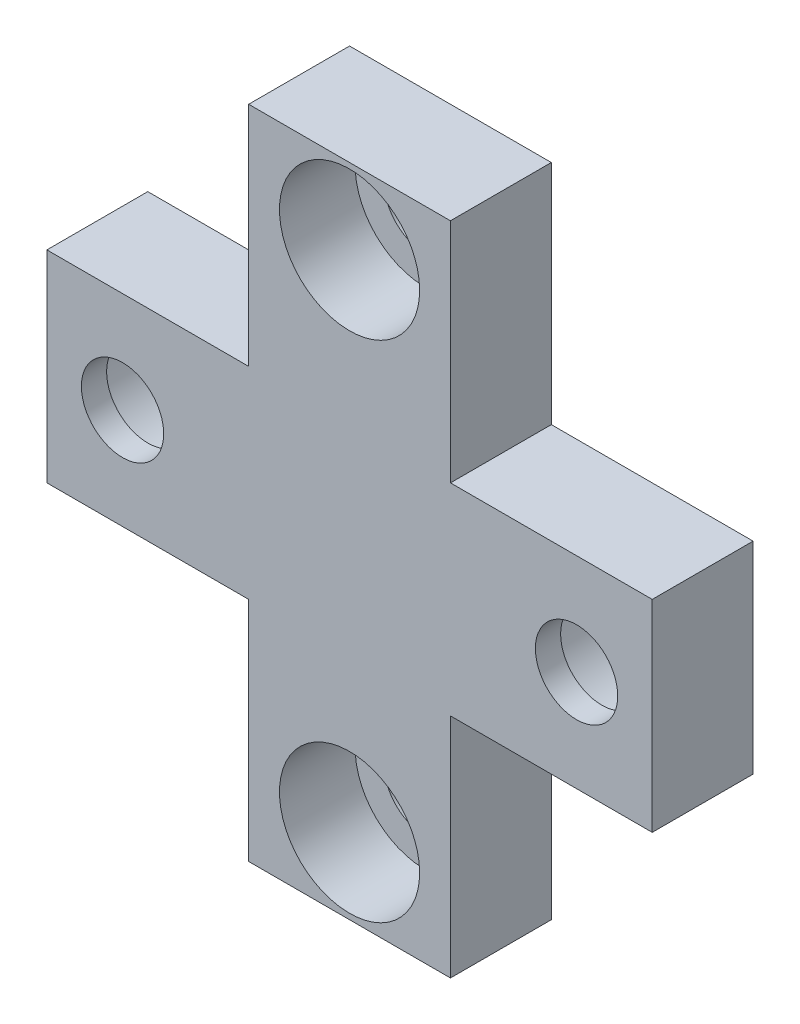
ISO-10303-21;
HEADER;
FILE_DESCRIPTION(('STEP AP214'),'2;1');
FILE_NAME('part.step','',(''),(''),'','','');
FILE_SCHEMA(('AUTOMOTIVE_DESIGN { 1 0 10303 214 1 1 1 1 }'));
ENDSEC;
DATA;
#1=APPLICATION_CONTEXT('core data for automotive mechanical design processes');
#2=APPLICATION_PROTOCOL_DEFINITION('international standard','automotive_design',2000,#1);
#3=PRODUCT_CONTEXT('',#1,'mechanical');
#4=PRODUCT('Part','Part','',(#3));
#5=PRODUCT_RELATED_PRODUCT_CATEGORY('part','',(#4));
#6=PRODUCT_DEFINITION_FORMATION('','',#4);
#7=PRODUCT_DEFINITION_CONTEXT('part definition',#1,'design');
#8=PRODUCT_DEFINITION('design','',#6,#7);
#9=PRODUCT_DEFINITION_SHAPE('','',#8);
#10=(LENGTH_UNIT() NAMED_UNIT(*) SI_UNIT(.MILLI.,.METRE.));
#11=(NAMED_UNIT(*) PLANE_ANGLE_UNIT() SI_UNIT($,.RADIAN.));
#12=(NAMED_UNIT(*) SI_UNIT($,.STERADIAN.) SOLID_ANGLE_UNIT());
#13=UNCERTAINTY_MEASURE_WITH_UNIT(LENGTH_MEASURE(1.E-05),#10,'distance_accuracy_value','');
#14=(GEOMETRIC_REPRESENTATION_CONTEXT(3) GLOBAL_UNCERTAINTY_ASSIGNED_CONTEXT((#13)) GLOBAL_UNIT_ASSIGNED_CONTEXT((#10,
#11,#12)) REPRESENTATION_CONTEXT('',''));
#15=CARTESIAN_POINT('',(0.,0.,0.));
#16=DIRECTION('',(0.,0.,1.));
#17=DIRECTION('',(1.,0.,0.));
#18=AXIS2_PLACEMENT_3D('',#15,#16,#17);
#19=CARTESIAN_POINT('',(0.,0.,4.));
#20=DIRECTION('',(1.,0.,0.));
#21=DIRECTION('',(0.,1.,0.));
#22=AXIS2_PLACEMENT_3D('',#19,#20,#21);
#23=PLANE('',#22);
#24=DIRECTION('',(0.,-1.,0.));
#25=VECTOR('',#24,1.);
#26=CARTESIAN_POINT('',(0.,0.,0.));
#27=LINE('',#26,#25);
#28=CARTESIAN_POINT('',(0.,0.,0.));
#29=VERTEX_POINT('',#28);
#30=CARTESIAN_POINT('',(0.,-9.,0.));
#31=VERTEX_POINT('',#30);
#32=EDGE_CURVE('E171',#29,#31,#27,.T.);
#33=ORIENTED_EDGE('',*,*,#32,.T.);
#34=DIRECTION('',(0.,0.,-1.));
#35=VECTOR('',#34,1.);
#36=CARTESIAN_POINT('',(0.,-9.,4.));
#37=LINE('',#36,#35);
#38=CARTESIAN_POINT('',(0.,-9.,4.));
#39=VERTEX_POINT('',#38);
#40=EDGE_CURVE('E11',#39,#31,#37,.T.);
#41=ORIENTED_EDGE('',*,*,#40,.F.);
#42=DIRECTION('',(0.,-1.,0.));
#43=VECTOR('',#42,1.);
#44=CARTESIAN_POINT('',(0.,0.,4.));
#45=LINE('',#44,#43);
#46=CARTESIAN_POINT('',(0.,0.,4.));
#47=VERTEX_POINT('',#46);
#48=EDGE_CURVE('E114',#47,#39,#45,.T.);
#49=ORIENTED_EDGE('',*,*,#48,.F.);
#50=DIRECTION('',(0.,0.,-1.));
#51=VECTOR('',#50,1.);
#52=CARTESIAN_POINT('',(0.,0.,4.));
#53=LINE('',#52,#51);
#54=EDGE_CURVE('E65',#47,#29,#53,.T.);
#55=ORIENTED_EDGE('',*,*,#54,.T.);
#56=EDGE_LOOP('',(#33,#41,#49,#55));
#57=FACE_BOUND('',#56,.T.);
#58=ADVANCED_FACE('F48',(#57),#23,.F.);
#59=CARTESIAN_POINT('',(0.,-9.,4.));
#60=DIRECTION('',(0.,1.,0.));
#61=DIRECTION('',(0.,0.,1.));
#62=AXIS2_PLACEMENT_3D('',#59,#60,#61);
#63=PLANE('',#62);
#64=DIRECTION('',(1.,0.,0.));
#65=VECTOR('',#64,1.);
#66=CARTESIAN_POINT('',(0.,-9.,0.));
#67=LINE('',#66,#65);
#68=CARTESIAN_POINT('',(-8.,-9.,0.));
#69=VERTEX_POINT('',#68);
#70=EDGE_CURVE('E174',#69,#31,#67,.T.);
#71=ORIENTED_EDGE('',*,*,#70,.F.);
#72=DIRECTION('',(0.,0.,-1.));
#73=VECTOR('',#72,1.);
#74=CARTESIAN_POINT('',(-8.,-9.,4.));
#75=LINE('',#74,#73);
#76=CARTESIAN_POINT('',(-8.,-9.,4.));
#77=VERTEX_POINT('',#76);
#78=EDGE_CURVE('E57',#77,#69,#75,.T.);
#79=ORIENTED_EDGE('',*,*,#78,.F.);
#80=DIRECTION('',(1.,0.,0.));
#81=VECTOR('',#80,1.);
#82=CARTESIAN_POINT('',(0.,-9.,4.));
#83=LINE('',#82,#81);
#84=EDGE_CURVE('E254',#77,#39,#83,.T.);
#85=ORIENTED_EDGE('',*,*,#84,.T.);
#86=ORIENTED_EDGE('',*,*,#40,.T.);
#87=EDGE_LOOP('',(#71,#79,#85,#86));
#88=FACE_BOUND('',#87,.T.);
#89=ADVANCED_FACE('F253',(#88),#63,.T.);
#90=CARTESIAN_POINT('',(-8.,0.,4.));
#91=DIRECTION('',(1.,0.,0.));
#92=DIRECTION('',(0.,0.,-1.));
#93=AXIS2_PLACEMENT_3D('',#90,#91,#92);
#94=PLANE('',#93);
#95=DIRECTION('',(0.,-1.,0.));
#96=VECTOR('',#95,1.);
#97=CARTESIAN_POINT('',(-8.,0.,0.));
#98=LINE('',#97,#96);
#99=CARTESIAN_POINT('',(-8.,-17.,0.));
#100=VERTEX_POINT('',#99);
#101=EDGE_CURVE('E179',#69,#100,#98,.T.);
#102=ORIENTED_EDGE('',*,*,#101,.T.);
#103=DIRECTION('',(0.,0.,-1.));
#104=VECTOR('',#103,1.);
#105=CARTESIAN_POINT('',(-8.,-17.,4.));
#106=LINE('',#105,#104);
#107=CARTESIAN_POINT('',(-8.,-17.,4.));
#108=VERTEX_POINT('',#107);
#109=EDGE_CURVE('E236',#108,#100,#106,.T.);
#110=ORIENTED_EDGE('',*,*,#109,.F.);
#111=DIRECTION('',(0.,-1.,0.));
#112=VECTOR('',#111,1.);
#113=CARTESIAN_POINT('',(-8.,0.,4.));
#114=LINE('',#113,#112);
#115=EDGE_CURVE('E245',#77,#108,#114,.T.);
#116=ORIENTED_EDGE('',*,*,#115,.F.);
#117=ORIENTED_EDGE('',*,*,#78,.T.);
#118=EDGE_LOOP('',(#102,#110,#116,#117));
#119=FACE_BOUND('',#118,.T.);
#120=ADVANCED_FACE('F243',(#119),#94,.F.);
#121=CARTESIAN_POINT('',(0.,-17.,4.));
#122=DIRECTION('',(0.,1.,0.));
#123=DIRECTION('',(0.,0.,1.));
#124=AXIS2_PLACEMENT_3D('',#121,#122,#123);
#125=PLANE('',#124);
#126=DIRECTION('',(1.,0.,0.));
#127=VECTOR('',#126,1.);
#128=CARTESIAN_POINT('',(0.,-17.,0.));
#129=LINE('',#128,#127);
#130=CARTESIAN_POINT('',(0.,-17.,0.));
#131=VERTEX_POINT('',#130);
#132=EDGE_CURVE('E182',#100,#131,#129,.T.);
#133=ORIENTED_EDGE('',*,*,#132,.T.);
#134=DIRECTION('',(0.,0.,-1.));
#135=VECTOR('',#134,1.);
#136=CARTESIAN_POINT('',(0.,-17.,4.));
#137=LINE('',#136,#135);
#138=CARTESIAN_POINT('',(0.,-17.,4.));
#139=VERTEX_POINT('',#138);
#140=EDGE_CURVE('E232',#139,#131,#137,.T.);
#141=ORIENTED_EDGE('',*,*,#140,.F.);
#142=DIRECTION('',(1.,0.,0.));
#143=VECTOR('',#142,1.);
#144=CARTESIAN_POINT('',(0.,-17.,4.));
#145=LINE('',#144,#143);
#146=EDGE_CURVE('E642',#108,#139,#145,.T.);
#147=ORIENTED_EDGE('',*,*,#146,.F.);
#148=ORIENTED_EDGE('',*,*,#109,.T.);
#149=EDGE_LOOP('',(#133,#141,#147,#148));
#150=FACE_BOUND('',#149,.T.);
#151=ADVANCED_FACE('F273',(#150),#125,.F.);
#152=CARTESIAN_POINT('',(0.,0.,4.));
#153=DIRECTION('',(1.,0.,0.));
#154=DIRECTION('',(0.,1.,0.));
#155=AXIS2_PLACEMENT_3D('',#152,#153,#154);
#156=PLANE('',#155);
#157=DIRECTION('',(0.,-1.,0.));
#158=VECTOR('',#157,1.);
#159=CARTESIAN_POINT('',(0.,0.,0.));
#160=LINE('',#159,#158);
#161=CARTESIAN_POINT('',(0.,-26.,0.));
#162=VERTEX_POINT('',#161);
#163=EDGE_CURVE('E185',#131,#162,#160,.T.);
#164=ORIENTED_EDGE('',*,*,#163,.T.);
#165=DIRECTION('',(0.,0.,-1.));
#166=VECTOR('',#165,1.);
#167=CARTESIAN_POINT('',(0.,-26.,4.));
#168=LINE('',#167,#166);
#169=CARTESIAN_POINT('',(0.,-26.,4.));
#170=VERTEX_POINT('',#169);
#171=EDGE_CURVE('E229',#170,#162,#168,.T.);
#172=ORIENTED_EDGE('',*,*,#171,.F.);
#173=DIRECTION('',(0.,-1.,0.));
#174=VECTOR('',#173,1.);
#175=CARTESIAN_POINT('',(0.,0.,4.));
#176=LINE('',#175,#174);
#177=EDGE_CURVE('E645',#139,#170,#176,.T.);
#178=ORIENTED_EDGE('',*,*,#177,.F.);
#179=ORIENTED_EDGE('',*,*,#140,.T.);
#180=EDGE_LOOP('',(#164,#172,#178,#179));
#181=FACE_BOUND('',#180,.T.);
#182=ADVANCED_FACE('F278',(#181),#156,.F.);
#183=CARTESIAN_POINT('',(0.,-26.,4.));
#184=DIRECTION('',(0.,-1.,0.));
#185=DIRECTION('',(0.,0.,-1.));
#186=AXIS2_PLACEMENT_3D('',#183,#184,#185);
#187=PLANE('',#186);
#188=DIRECTION('',(-1.,0.,0.));
#189=VECTOR('',#188,1.);
#190=CARTESIAN_POINT('',(0.,-26.,0.));
#191=LINE('',#190,#189);
#192=CARTESIAN_POINT('',(8.,-26.,0.));
#193=VERTEX_POINT('',#192);
#194=EDGE_CURVE('E189',#193,#162,#191,.T.);
#195=ORIENTED_EDGE('',*,*,#194,.F.);
#196=DIRECTION('',(0.,0.,-1.));
#197=VECTOR('',#196,1.);
#198=CARTESIAN_POINT('',(8.,-26.,4.));
#199=LINE('',#198,#197);
#200=CARTESIAN_POINT('',(8.,-26.,4.));
#201=VERTEX_POINT('',#200);
#202=EDGE_CURVE('E226',#201,#193,#199,.T.);
#203=ORIENTED_EDGE('',*,*,#202,.F.);
#204=DIRECTION('',(-1.,0.,0.));
#205=VECTOR('',#204,1.);
#206=CARTESIAN_POINT('',(0.,-26.,4.));
#207=LINE('',#206,#205);
#208=EDGE_CURVE('E648',#201,#170,#207,.T.);
#209=ORIENTED_EDGE('',*,*,#208,.T.);
#210=ORIENTED_EDGE('',*,*,#171,.T.);
#211=EDGE_LOOP('',(#195,#203,#209,#210));
#212=FACE_BOUND('',#211,.T.);
#213=ADVANCED_FACE('F282',(#212),#187,.T.);
#214=CARTESIAN_POINT('',(8.,0.,4.));
#215=DIRECTION('',(1.,0.,0.));
#216=DIRECTION('',(0.,0.,-1.));
#217=AXIS2_PLACEMENT_3D('',#214,#215,#216);
#218=PLANE('',#217);
#219=DIRECTION('',(0.,-1.,0.));
#220=VECTOR('',#219,1.);
#221=CARTESIAN_POINT('',(8.,0.,0.));
#222=LINE('',#221,#220);
#223=CARTESIAN_POINT('',(8.,-17.,0.));
#224=VERTEX_POINT('',#223);
#225=EDGE_CURVE('E193',#224,#193,#222,.T.);
#226=ORIENTED_EDGE('',*,*,#225,.F.);
#227=DIRECTION('',(0.,0.,-1.));
#228=VECTOR('',#227,1.);
#229=CARTESIAN_POINT('',(8.,-17.,4.));
#230=LINE('',#229,#228);
#231=CARTESIAN_POINT('',(8.,-17.,4.));
#232=VERTEX_POINT('',#231);
#233=EDGE_CURVE('E223',#232,#224,#230,.T.);
#234=ORIENTED_EDGE('',*,*,#233,.F.);
#235=DIRECTION('',(0.,-1.,0.));
#236=VECTOR('',#235,1.);
#237=CARTESIAN_POINT('',(8.,0.,4.));
#238=LINE('',#237,#236);
#239=EDGE_CURVE('E652',#232,#201,#238,.T.);
#240=ORIENTED_EDGE('',*,*,#239,.T.);
#241=ORIENTED_EDGE('',*,*,#202,.T.);
#242=EDGE_LOOP('',(#226,#234,#240,#241));
#243=FACE_BOUND('',#242,.T.);
#244=ADVANCED_FACE('F286',(#243),#218,.T.);
#245=CARTESIAN_POINT('',(0.,-17.,4.));
#246=DIRECTION('',(0.,1.,0.));
#247=DIRECTION('',(0.,0.,1.));
#248=AXIS2_PLACEMENT_3D('',#245,#246,#247);
#249=PLANE('',#248);
#250=DIRECTION('',(1.,0.,0.));
#251=VECTOR('',#250,1.);
#252=CARTESIAN_POINT('',(0.,-17.,0.));
#253=LINE('',#252,#251);
#254=CARTESIAN_POINT('',(16.,-17.,0.));
#255=VERTEX_POINT('',#254);
#256=EDGE_CURVE('E197',#224,#255,#253,.T.);
#257=ORIENTED_EDGE('',*,*,#256,.T.);
#258=DIRECTION('',(0.,0.,-1.));
#259=VECTOR('',#258,1.);
#260=CARTESIAN_POINT('',(16.,-17.,4.));
#261=LINE('',#260,#259);
#262=CARTESIAN_POINT('',(16.,-17.,4.));
#263=VERTEX_POINT('',#262);
#264=EDGE_CURVE('E220',#263,#255,#261,.T.);
#265=ORIENTED_EDGE('',*,*,#264,.F.);
#266=DIRECTION('',(1.,0.,0.));
#267=VECTOR('',#266,1.);
#268=CARTESIAN_POINT('',(0.,-17.,4.));
#269=LINE('',#268,#267);
#270=EDGE_CURVE('E656',#232,#263,#269,.T.);
#271=ORIENTED_EDGE('',*,*,#270,.F.);
#272=ORIENTED_EDGE('',*,*,#233,.T.);
#273=EDGE_LOOP('',(#257,#265,#271,#272));
#274=FACE_BOUND('',#273,.T.);
#275=ADVANCED_FACE('F290',(#274),#249,.F.);
#276=CARTESIAN_POINT('',(16.,0.,4.));
#277=DIRECTION('',(1.,0.,0.));
#278=DIRECTION('',(0.,0.,-1.));
#279=AXIS2_PLACEMENT_3D('',#276,#277,#278);
#280=PLANE('',#279);
#281=DIRECTION('',(0.,-1.,0.));
#282=VECTOR('',#281,1.);
#283=CARTESIAN_POINT('',(16.,0.,0.));
#284=LINE('',#283,#282);
#285=CARTESIAN_POINT('',(16.,-9.,0.));
#286=VERTEX_POINT('',#285);
#287=EDGE_CURVE('E201',#286,#255,#284,.T.);
#288=ORIENTED_EDGE('',*,*,#287,.F.);
#289=DIRECTION('',(0.,0.,-1.));
#290=VECTOR('',#289,1.);
#291=CARTESIAN_POINT('',(16.,-9.,4.));
#292=LINE('',#291,#290);
#293=CARTESIAN_POINT('',(16.,-9.,4.));
#294=VERTEX_POINT('',#293);
#295=EDGE_CURVE('E153',#294,#286,#292,.T.);
#296=ORIENTED_EDGE('',*,*,#295,.F.);
#297=DIRECTION('',(0.,-1.,0.));
#298=VECTOR('',#297,1.);
#299=CARTESIAN_POINT('',(16.,0.,4.));
#300=LINE('',#299,#298);
#301=EDGE_CURVE('E160',#294,#263,#300,.T.);
#302=ORIENTED_EDGE('',*,*,#301,.T.);
#303=ORIENTED_EDGE('',*,*,#264,.T.);
#304=EDGE_LOOP('',(#288,#296,#302,#303));
#305=FACE_BOUND('',#304,.T.);
#306=ADVANCED_FACE('F294',(#305),#280,.T.);
#307=CARTESIAN_POINT('',(0.,-9.,4.));
#308=DIRECTION('',(0.,1.,0.));
#309=DIRECTION('',(0.,0.,1.));
#310=AXIS2_PLACEMENT_3D('',#307,#308,#309);
#311=PLANE('',#310);
#312=DIRECTION('',(1.,0.,0.));
#313=VECTOR('',#312,1.);
#314=CARTESIAN_POINT('',(0.,-9.,0.));
#315=LINE('',#314,#313);
#316=CARTESIAN_POINT('',(8.,-9.,0.));
#317=VERTEX_POINT('',#316);
#318=EDGE_CURVE('E148',#317,#286,#315,.T.);
#319=ORIENTED_EDGE('',*,*,#318,.F.);
#320=DIRECTION('',(0.,0.,-1.));
#321=VECTOR('',#320,1.);
#322=CARTESIAN_POINT('',(8.,-9.,4.));
#323=LINE('',#322,#321);
#324=CARTESIAN_POINT('',(8.,-9.,4.));
#325=VERTEX_POINT('',#324);
#326=EDGE_CURVE('E143',#325,#317,#323,.T.);
#327=ORIENTED_EDGE('',*,*,#326,.F.);
#328=DIRECTION('',(1.,0.,0.));
#329=VECTOR('',#328,1.);
#330=CARTESIAN_POINT('',(0.,-9.,4.));
#331=LINE('',#330,#329);
#332=EDGE_CURVE('E146',#325,#294,#331,.T.);
#333=ORIENTED_EDGE('',*,*,#332,.T.);
#334=ORIENTED_EDGE('',*,*,#295,.T.);
#335=EDGE_LOOP('',(#319,#327,#333,#334));
#336=FACE_BOUND('',#335,.T.);
#337=ADVANCED_FACE('F145',(#336),#311,.T.);
#338=CARTESIAN_POINT('',(8.,0.,4.));
#339=DIRECTION('',(1.,0.,0.));
#340=DIRECTION('',(0.,0.,-1.));
#341=AXIS2_PLACEMENT_3D('',#338,#339,#340);
#342=PLANE('',#341);
#343=DIRECTION('',(0.,-1.,0.));
#344=VECTOR('',#343,1.);
#345=CARTESIAN_POINT('',(8.,0.,0.));
#346=LINE('',#345,#344);
#347=CARTESIAN_POINT('',(8.,0.,0.));
#348=VERTEX_POINT('',#347);
#349=EDGE_CURVE('E207',#348,#317,#346,.T.);
#350=ORIENTED_EDGE('',*,*,#349,.F.);
#351=DIRECTION('',(0.,0.,-1.));
#352=VECTOR('',#351,1.);
#353=CARTESIAN_POINT('',(8.,0.,4.));
#354=LINE('',#353,#352);
#355=CARTESIAN_POINT('',(8.,0.,4.));
#356=VERTEX_POINT('',#355);
#357=EDGE_CURVE('E102',#356,#348,#354,.T.);
#358=ORIENTED_EDGE('',*,*,#357,.F.);
#359=DIRECTION('',(0.,-1.,0.));
#360=VECTOR('',#359,1.);
#361=CARTESIAN_POINT('',(8.,0.,4.));
#362=LINE('',#361,#360);
#363=EDGE_CURVE('E158',#356,#325,#362,.T.);
#364=ORIENTED_EDGE('',*,*,#363,.T.);
#365=ORIENTED_EDGE('',*,*,#326,.T.);
#366=EDGE_LOOP('',(#350,#358,#364,#365));
#367=FACE_BOUND('',#366,.T.);
#368=ADVANCED_FACE('F163',(#367),#342,.T.);
#369=CARTESIAN_POINT('',(0.,0.,4.));
#370=DIRECTION('',(0.,1.,0.));
#371=DIRECTION('',(0.,0.,1.));
#372=AXIS2_PLACEMENT_3D('',#369,#370,#371);
#373=PLANE('',#372);
#374=DIRECTION('',(1.,0.,0.));
#375=VECTOR('',#374,1.);
#376=CARTESIAN_POINT('',(0.,0.,0.));
#377=LINE('',#376,#375);
#378=EDGE_CURVE('E210',#29,#348,#377,.T.);
#379=ORIENTED_EDGE('',*,*,#378,.F.);
#380=ORIENTED_EDGE('',*,*,#54,.F.);
#381=DIRECTION('',(1.,0.,0.));
#382=VECTOR('',#381,1.);
#383=CARTESIAN_POINT('',(0.,0.,4.));
#384=LINE('',#383,#382);
#385=EDGE_CURVE('E165',#47,#356,#384,.T.);
#386=ORIENTED_EDGE('',*,*,#385,.T.);
#387=ORIENTED_EDGE('',*,*,#357,.T.);
#388=EDGE_LOOP('',(#379,#380,#386,#387));
#389=FACE_BOUND('',#388,.T.);
#390=ADVANCED_FACE('F255',(#389),#373,.T.);
#391=CARTESIAN_POINT('',(0.,0.,4.));
#392=DIRECTION('',(0.,0.,1.));
#393=DIRECTION('',(1.,0.,0.));
#394=AXIS2_PLACEMENT_3D('',#391,#392,#393);
#395=PLANE('',#394);
#396=CARTESIAN_POINT('',(13.,-13.,4.));
#397=DIRECTION('',(0.,0.,-1.));
#398=DIRECTION('',(-1.,0.,0.));
#399=AXIS2_PLACEMENT_3D('',#396,#397,#398);
#400=CIRCLE('',#399,1.63195);
#401=CARTESIAN_POINT('',(11.36805,-13.,4.));
#402=VERTEX_POINT('',#401);
#403=EDGE_CURVE('E706',#402,#402,#400,.T.);
#404=ORIENTED_EDGE('',*,*,#403,.T.);
#405=EDGE_LOOP('',(#404));
#406=FACE_BOUND('',#405,.T.);
#407=CARTESIAN_POINT('',(-5.,-13.,4.));
#408=DIRECTION('',(0.,0.,-1.));
#409=DIRECTION('',(-1.,0.,0.));
#410=AXIS2_PLACEMENT_3D('',#407,#408,#409);
#411=CIRCLE('',#410,1.63195);
#412=CARTESIAN_POINT('',(-6.63195,-13.,4.));
#413=VERTEX_POINT('',#412);
#414=EDGE_CURVE('E692',#413,#413,#411,.T.);
#415=ORIENTED_EDGE('',*,*,#414,.T.);
#416=EDGE_LOOP('',(#415));
#417=FACE_BOUND('',#416,.T.);
#418=CARTESIAN_POINT('',(4.,-3.,4.));
#419=DIRECTION('',(0.,0.,1.));
#420=DIRECTION('',(1.,0.,0.));
#421=AXIS2_PLACEMENT_3D('',#418,#419,#420);
#422=CIRCLE('',#421,2.77875999999999);
#423=CARTESIAN_POINT('',(6.77875999999999,-3.,4.));
#424=VERTEX_POINT('',#423);
#425=EDGE_CURVE('E688',#424,#424,#422,.T.);
#426=ORIENTED_EDGE('',*,*,#425,.F.);
#427=EDGE_LOOP('',(#426));
#428=FACE_BOUND('',#427,.T.);
#429=CARTESIAN_POINT('',(4.,-23.,4.));
#430=DIRECTION('',(0.,0.,1.));
#431=DIRECTION('',(1.,0.,0.));
#432=AXIS2_PLACEMENT_3D('',#429,#430,#431);
#433=CIRCLE('',#432,2.77875999999999);
#434=CARTESIAN_POINT('',(6.77876,-23.,4.));
#435=VERTEX_POINT('',#434);
#436=EDGE_CURVE('E674',#435,#435,#433,.T.);
#437=ORIENTED_EDGE('',*,*,#436,.F.);
#438=EDGE_LOOP('',(#437));
#439=FACE_BOUND('',#438,.T.);
#440=ORIENTED_EDGE('',*,*,#48,.T.);
#441=ORIENTED_EDGE('',*,*,#84,.F.);
#442=ORIENTED_EDGE('',*,*,#115,.T.);
#443=ORIENTED_EDGE('',*,*,#146,.T.);
#444=ORIENTED_EDGE('',*,*,#177,.T.);
#445=ORIENTED_EDGE('',*,*,#208,.F.);
#446=ORIENTED_EDGE('',*,*,#239,.F.);
#447=ORIENTED_EDGE('',*,*,#270,.T.);
#448=ORIENTED_EDGE('',*,*,#301,.F.);
#449=ORIENTED_EDGE('',*,*,#332,.F.);
#450=ORIENTED_EDGE('',*,*,#363,.F.);
#451=ORIENTED_EDGE('',*,*,#385,.F.);
#452=EDGE_LOOP('',(#440,#441,#442,#443,#444,#445,#446,#447,#448,#449,#450,#451));
#453=FACE_BOUND('',#452,.T.);
#454=ADVANCED_FACE('F157',(#406,#417,#428,#439,#453),#395,.T.);
#455=CARTESIAN_POINT('',(0.,0.,0.));
#456=DIRECTION('',(0.,0.,1.));
#457=DIRECTION('',(1.,0.,0.));
#458=AXIS2_PLACEMENT_3D('',#455,#456,#457);
#459=PLANE('',#458);
#460=CARTESIAN_POINT('',(13.,-13.,0.));
#461=DIRECTION('',(0.,0.,-1.));
#462=DIRECTION('',(-1.,0.,0.));
#463=AXIS2_PLACEMENT_3D('',#460,#461,#462);
#464=CIRCLE('',#463,2.77876);
#465=CARTESIAN_POINT('',(10.22124,-13.,0.));
#466=VERTEX_POINT('',#465);
#467=EDGE_CURVE('E616',#466,#466,#464,.T.);
#468=ORIENTED_EDGE('',*,*,#467,.F.);
#469=EDGE_LOOP('',(#468));
#470=FACE_BOUND('',#469,.T.);
#471=CARTESIAN_POINT('',(-5.,-13.,0.));
#472=DIRECTION('',(0.,0.,-1.));
#473=DIRECTION('',(-1.,0.,0.));
#474=AXIS2_PLACEMENT_3D('',#471,#472,#473);
#475=CIRCLE('',#474,2.77875999999999);
#476=CARTESIAN_POINT('',(-7.77875999999999,-13.,0.));
#477=VERTEX_POINT('',#476);
#478=EDGE_CURVE('E620',#477,#477,#475,.T.);
#479=ORIENTED_EDGE('',*,*,#478,.F.);
#480=EDGE_LOOP('',(#479));
#481=FACE_BOUND('',#480,.T.);
#482=CARTESIAN_POINT('',(4.,-3.,0.));
#483=DIRECTION('',(0.,0.,1.));
#484=DIRECTION('',(1.,0.,0.));
#485=AXIS2_PLACEMENT_3D('',#482,#483,#484);
#486=CIRCLE('',#485,1.63195);
#487=CARTESIAN_POINT('',(5.63195,-3.,0.));
#488=VERTEX_POINT('',#487);
#489=EDGE_CURVE('E624',#488,#488,#486,.T.);
#490=ORIENTED_EDGE('',*,*,#489,.T.);
#491=EDGE_LOOP('',(#490));
#492=FACE_BOUND('',#491,.T.);
#493=CARTESIAN_POINT('',(4.,-23.,0.));
#494=DIRECTION('',(0.,0.,1.));
#495=DIRECTION('',(1.,0.,0.));
#496=AXIS2_PLACEMENT_3D('',#493,#494,#495);
#497=CIRCLE('',#496,1.63195);
#498=CARTESIAN_POINT('',(5.63195,-23.,0.));
#499=VERTEX_POINT('',#498);
#500=EDGE_CURVE('E175',#499,#499,#497,.T.);
#501=ORIENTED_EDGE('',*,*,#500,.T.);
#502=EDGE_LOOP('',(#501));
#503=FACE_BOUND('',#502,.T.);
#504=ORIENTED_EDGE('',*,*,#32,.F.);
#505=ORIENTED_EDGE('',*,*,#378,.T.);
#506=ORIENTED_EDGE('',*,*,#349,.T.);
#507=ORIENTED_EDGE('',*,*,#318,.T.);
#508=ORIENTED_EDGE('',*,*,#287,.T.);
#509=ORIENTED_EDGE('',*,*,#256,.F.);
#510=ORIENTED_EDGE('',*,*,#225,.T.);
#511=ORIENTED_EDGE('',*,*,#194,.T.);
#512=ORIENTED_EDGE('',*,*,#163,.F.);
#513=ORIENTED_EDGE('',*,*,#132,.F.);
#514=ORIENTED_EDGE('',*,*,#101,.F.);
#515=ORIENTED_EDGE('',*,*,#70,.T.);
#516=EDGE_LOOP('',(#504,#505,#506,#507,#508,#509,#510,#511,#512,#513,#514,#515));
#517=FACE_BOUND('',#516,.T.);
#518=ADVANCED_FACE('F251',(#470,#481,#492,#503,#517),#459,.F.);
#519=CARTESIAN_POINT('',(4.,-23.,4.));
#520=DIRECTION('',(0.,0.,1.));
#521=DIRECTION('',(1.,0.,0.));
#522=AXIS2_PLACEMENT_3D('',#519,#520,#521);
#523=CYLINDRICAL_SURFACE('',#522,1.63195);
#524=ORIENTED_EDGE('',*,*,#500,.F.);
#525=EDGE_LOOP('',(#524));
#526=FACE_BOUND('',#525,.T.);
#527=CARTESIAN_POINT('',(4.,-23.,0.999999904));
#528=DIRECTION('',(0.,0.,1.));
#529=DIRECTION('',(1.,0.,0.));
#530=AXIS2_PLACEMENT_3D('',#527,#528,#529);
#531=CIRCLE('',#530,1.63195);
#532=CARTESIAN_POINT('',(5.63195,-23.,0.999999904));
#533=VERTEX_POINT('',#532);
#534=EDGE_CURVE('E628',#533,#533,#531,.T.);
#535=ORIENTED_EDGE('',*,*,#534,.T.);
#536=EDGE_LOOP('',(#535));
#537=FACE_BOUND('',#536,.T.);
#538=ADVANCED_FACE('F341',(#526,#537),#523,.F.);
#539=CARTESIAN_POINT('',(5.63195,-23.,0.999999904));
#540=DIRECTION('',(0.,0.,-1.));
#541=DIRECTION('',(-1.,0.,0.));
#542=AXIS2_PLACEMENT_3D('',#539,#540,#541);
#543=PLANE('',#542);
#544=ORIENTED_EDGE('',*,*,#534,.F.);
#545=EDGE_LOOP('',(#544));
#546=FACE_BOUND('',#545,.T.);
#547=CARTESIAN_POINT('',(4.,-23.,0.999999904));
#548=DIRECTION('',(0.,0.,1.));
#549=DIRECTION('',(1.,0.,0.));
#550=AXIS2_PLACEMENT_3D('',#547,#548,#549);
#551=CIRCLE('',#550,2.77876);
#552=CARTESIAN_POINT('',(6.77876,-23.,0.999999904));
#553=VERTEX_POINT('',#552);
#554=EDGE_CURVE('E632',#553,#553,#551,.T.);
#555=ORIENTED_EDGE('',*,*,#554,.T.);
#556=EDGE_LOOP('',(#555));
#557=FACE_BOUND('',#556,.T.);
#558=ADVANCED_FACE('F327',(#546,#557),#543,.F.);
#559=CARTESIAN_POINT('',(4.,-23.,4.));
#560=DIRECTION('',(0.,0.,1.));
#561=DIRECTION('',(1.,0.,0.));
#562=AXIS2_PLACEMENT_3D('',#559,#560,#561);
#563=CYLINDRICAL_SURFACE('',#562,2.77876);
#564=ORIENTED_EDGE('',*,*,#554,.F.);
#565=EDGE_LOOP('',(#564));
#566=FACE_BOUND('',#565,.T.);
#567=ORIENTED_EDGE('',*,*,#436,.T.);
#568=EDGE_LOOP('',(#567));
#569=FACE_BOUND('',#568,.T.);
#570=ADVANCED_FACE('F323',(#566,#569),#563,.F.);
#571=CARTESIAN_POINT('',(4.,-3.,4.));
#572=DIRECTION('',(0.,0.,1.));
#573=DIRECTION('',(1.,0.,0.));
#574=AXIS2_PLACEMENT_3D('',#571,#572,#573);
#575=CYLINDRICAL_SURFACE('',#574,1.63195);
#576=ORIENTED_EDGE('',*,*,#489,.F.);
#577=EDGE_LOOP('',(#576));
#578=FACE_BOUND('',#577,.T.);
#579=CARTESIAN_POINT('',(4.,-3.,0.999999904));
#580=DIRECTION('',(0.,0.,1.));
#581=DIRECTION('',(1.,0.,0.));
#582=AXIS2_PLACEMENT_3D('',#579,#580,#581);
#583=CIRCLE('',#582,1.63195);
#584=CARTESIAN_POINT('',(5.63195,-3.,0.999999904));
#585=VERTEX_POINT('',#584);
#586=EDGE_CURVE('E680',#585,#585,#583,.T.);
#587=ORIENTED_EDGE('',*,*,#586,.T.);
#588=EDGE_LOOP('',(#587));
#589=FACE_BOUND('',#588,.T.);
#590=ADVANCED_FACE('F326',(#578,#589),#575,.F.);
#591=CARTESIAN_POINT('',(5.63195,-3.,0.999999904));
#592=DIRECTION('',(0.,0.,-1.));
#593=DIRECTION('',(-1.,0.,0.));
#594=AXIS2_PLACEMENT_3D('',#591,#592,#593);
#595=PLANE('',#594);
#596=ORIENTED_EDGE('',*,*,#586,.F.);
#597=EDGE_LOOP('',(#596));
#598=FACE_BOUND('',#597,.T.);
#599=CARTESIAN_POINT('',(4.,-3.,0.999999904));
#600=DIRECTION('',(0.,0.,1.));
#601=DIRECTION('',(1.,0.,0.));
#602=AXIS2_PLACEMENT_3D('',#599,#600,#601);
#603=CIRCLE('',#602,2.77876);
#604=CARTESIAN_POINT('',(6.77876,-3.,0.999999904));
#605=VERTEX_POINT('',#604);
#606=EDGE_CURVE('E684',#605,#605,#603,.T.);
#607=ORIENTED_EDGE('',*,*,#606,.T.);
#608=EDGE_LOOP('',(#607));
#609=FACE_BOUND('',#608,.T.);
#610=ADVANCED_FACE('F315',(#598,#609),#595,.F.);
#611=CARTESIAN_POINT('',(4.,-3.,4.));
#612=DIRECTION('',(0.,0.,1.));
#613=DIRECTION('',(1.,0.,0.));
#614=AXIS2_PLACEMENT_3D('',#611,#612,#613);
#615=CYLINDRICAL_SURFACE('',#614,2.77876);
#616=ORIENTED_EDGE('',*,*,#606,.F.);
#617=EDGE_LOOP('',(#616));
#618=FACE_BOUND('',#617,.T.);
#619=ORIENTED_EDGE('',*,*,#425,.T.);
#620=EDGE_LOOP('',(#619));
#621=FACE_BOUND('',#620,.T.);
#622=ADVANCED_FACE('F311',(#618,#621),#615,.F.);
#623=CARTESIAN_POINT('',(-5.,-13.,0.));
#624=DIRECTION('',(0.,0.,-1.));
#625=DIRECTION('',(-1.,0.,0.));
#626=AXIS2_PLACEMENT_3D('',#623,#624,#625);
#627=CYLINDRICAL_SURFACE('',#626,1.63195);
#628=ORIENTED_EDGE('',*,*,#414,.F.);
#629=EDGE_LOOP('',(#628));
#630=FACE_BOUND('',#629,.T.);
#631=CARTESIAN_POINT('',(-5.,-13.,3.000000096));
#632=DIRECTION('',(0.,0.,-1.));
#633=DIRECTION('',(-1.,0.,0.));
#634=AXIS2_PLACEMENT_3D('',#631,#632,#633);
#635=CIRCLE('',#634,1.63195);
#636=CARTESIAN_POINT('',(-6.63195,-13.,3.000000096));
#637=VERTEX_POINT('',#636);
#638=EDGE_CURVE('E696',#637,#637,#635,.T.);
#639=ORIENTED_EDGE('',*,*,#638,.T.);
#640=EDGE_LOOP('',(#639));
#641=FACE_BOUND('',#640,.T.);
#642=ADVANCED_FACE('F314',(#630,#641),#627,.F.);
#643=CARTESIAN_POINT('',(-3.36805,-13.,3.000000096));
#644=DIRECTION('',(0.,0.,1.));
#645=DIRECTION('',(1.,0.,0.));
#646=AXIS2_PLACEMENT_3D('',#643,#644,#645);
#647=PLANE('',#646);
#648=ORIENTED_EDGE('',*,*,#638,.F.);
#649=EDGE_LOOP('',(#648));
#650=FACE_BOUND('',#649,.T.);
#651=CARTESIAN_POINT('',(-5.,-13.,3.000000096));
#652=DIRECTION('',(0.,0.,-1.));
#653=DIRECTION('',(-1.,0.,0.));
#654=AXIS2_PLACEMENT_3D('',#651,#652,#653);
#655=CIRCLE('',#654,2.77876);
#656=CARTESIAN_POINT('',(-7.77876,-13.,3.000000096));
#657=VERTEX_POINT('',#656);
#658=EDGE_CURVE('E700',#657,#657,#655,.T.);
#659=ORIENTED_EDGE('',*,*,#658,.T.);
#660=EDGE_LOOP('',(#659));
#661=FACE_BOUND('',#660,.T.);
#662=ADVANCED_FACE('F439',(#650,#661),#647,.F.);
#663=CARTESIAN_POINT('',(-5.,-13.,0.));
#664=DIRECTION('',(0.,0.,-1.));
#665=DIRECTION('',(-1.,0.,0.));
#666=AXIS2_PLACEMENT_3D('',#663,#664,#665);
#667=CYLINDRICAL_SURFACE('',#666,2.77876);
#668=ORIENTED_EDGE('',*,*,#658,.F.);
#669=EDGE_LOOP('',(#668));
#670=FACE_BOUND('',#669,.T.);
#671=ORIENTED_EDGE('',*,*,#478,.T.);
#672=EDGE_LOOP('',(#671));
#673=FACE_BOUND('',#672,.T.);
#674=ADVANCED_FACE('F428',(#670,#673),#667,.F.);
#675=CARTESIAN_POINT('',(13.,-13.,0.));
#676=DIRECTION('',(0.,0.,-1.));
#677=DIRECTION('',(-1.,0.,0.));
#678=AXIS2_PLACEMENT_3D('',#675,#676,#677);
#679=CYLINDRICAL_SURFACE('',#678,1.63195);
#680=ORIENTED_EDGE('',*,*,#403,.F.);
#681=EDGE_LOOP('',(#680));
#682=FACE_BOUND('',#681,.T.);
#683=CARTESIAN_POINT('',(13.,-13.,3.000000096));
#684=DIRECTION('',(0.,0.,-1.));
#685=DIRECTION('',(-1.,0.,0.));
#686=AXIS2_PLACEMENT_3D('',#683,#684,#685);
#687=CIRCLE('',#686,1.63195);
#688=CARTESIAN_POINT('',(11.36805,-13.,3.000000096));
#689=VERTEX_POINT('',#688);
#690=EDGE_CURVE('E710',#689,#689,#687,.T.);
#691=ORIENTED_EDGE('',*,*,#690,.T.);
#692=EDGE_LOOP('',(#691));
#693=FACE_BOUND('',#692,.T.);
#694=ADVANCED_FACE('F420',(#682,#693),#679,.F.);
#695=CARTESIAN_POINT('',(14.63195,-13.,3.000000096));
#696=DIRECTION('',(0.,0.,1.));
#697=DIRECTION('',(1.,0.,0.));
#698=AXIS2_PLACEMENT_3D('',#695,#696,#697);
#699=PLANE('',#698);
#700=ORIENTED_EDGE('',*,*,#690,.F.);
#701=EDGE_LOOP('',(#700));
#702=FACE_BOUND('',#701,.T.);
#703=CARTESIAN_POINT('',(13.,-13.,3.000000096));
#704=DIRECTION('',(0.,0.,-1.));
#705=DIRECTION('',(-1.,0.,0.));
#706=AXIS2_PLACEMENT_3D('',#703,#704,#705);
#707=CIRCLE('',#706,2.77876);
#708=CARTESIAN_POINT('',(10.22124,-13.,3.000000096));
#709=VERTEX_POINT('',#708);
#710=EDGE_CURVE('E714',#709,#709,#707,.T.);
#711=ORIENTED_EDGE('',*,*,#710,.T.);
#712=EDGE_LOOP('',(#711));
#713=FACE_BOUND('',#712,.T.);
#714=ADVANCED_FACE('F411',(#702,#713),#699,.F.);
#715=CARTESIAN_POINT('',(13.,-13.,0.));
#716=DIRECTION('',(0.,0.,-1.));
#717=DIRECTION('',(-1.,0.,0.));
#718=AXIS2_PLACEMENT_3D('',#715,#716,#717);
#719=CYLINDRICAL_SURFACE('',#718,2.77876);
#720=ORIENTED_EDGE('',*,*,#710,.F.);
#721=EDGE_LOOP('',(#720));
#722=FACE_BOUND('',#721,.T.);
#723=ORIENTED_EDGE('',*,*,#467,.T.);
#724=EDGE_LOOP('',(#723));
#725=FACE_BOUND('',#724,.T.);
#726=ADVANCED_FACE('F406',(#722,#725),#719,.F.);
#727=CLOSED_SHELL('',(#58,#89,#120,#151,#182,#213,#244,#275,#306,#337,#368,#390,#454,#518,#538,
#558,#570,#590,#610,#622,#642,#662,#674,#694,#714,#726));
#728=MANIFOLD_SOLID_BREP('B2',#727);
#729=ADVANCED_BREP_SHAPE_REPRESENTATION('',(#18,#728),#14);
#730=SHAPE_DEFINITION_REPRESENTATION(#9,#729);
ENDSEC;
END-ISO-10303-21;
